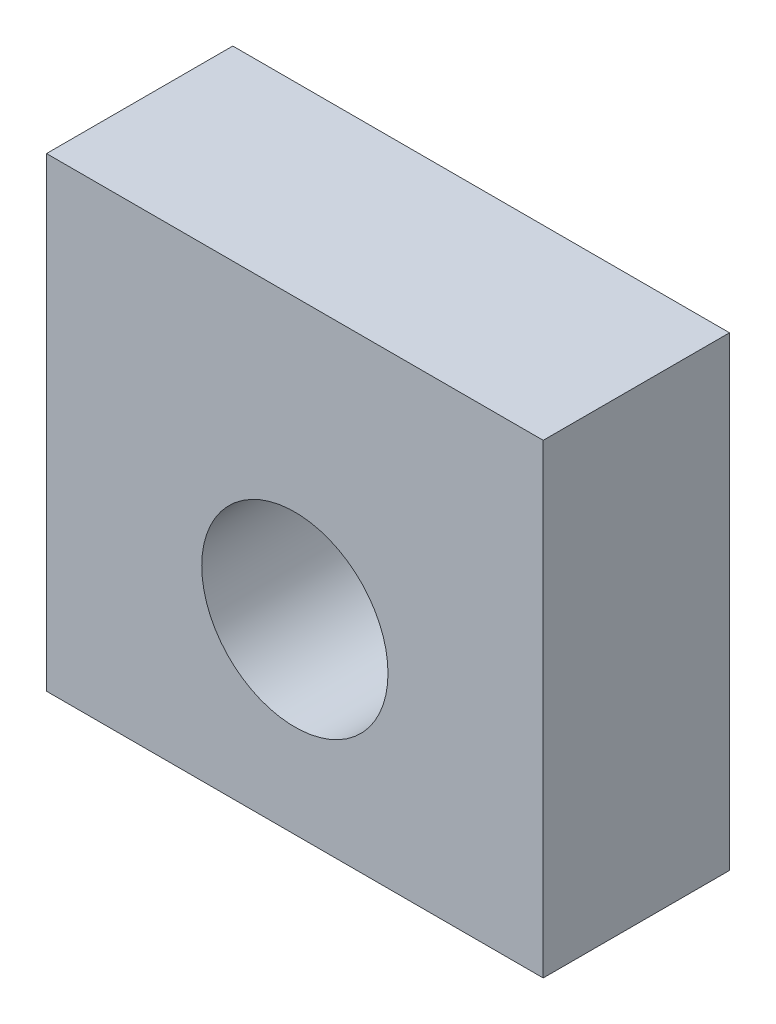
ISO-10303-21;
HEADER;
FILE_DESCRIPTION(('STEP AP214'),'2;1');
FILE_NAME('part.step','',(''),(''),'','','');
FILE_SCHEMA(('AUTOMOTIVE_DESIGN { 1 0 10303 214 1 1 1 1 }'));
ENDSEC;
DATA;
#1=APPLICATION_CONTEXT('core data for automotive mechanical design processes');
#2=APPLICATION_PROTOCOL_DEFINITION('international standard','automotive_design',2000,#1);
#3=PRODUCT_CONTEXT('',#1,'mechanical');
#4=PRODUCT('Part','Part','',(#3));
#5=PRODUCT_RELATED_PRODUCT_CATEGORY('part','',(#4));
#6=PRODUCT_DEFINITION_FORMATION('','',#4);
#7=PRODUCT_DEFINITION_CONTEXT('part definition',#1,'design');
#8=PRODUCT_DEFINITION('design','',#6,#7);
#9=PRODUCT_DEFINITION_SHAPE('','',#8);
#10=(LENGTH_UNIT() NAMED_UNIT(*) SI_UNIT(.MILLI.,.METRE.));
#11=(NAMED_UNIT(*) PLANE_ANGLE_UNIT() SI_UNIT($,.RADIAN.));
#12=(NAMED_UNIT(*) SI_UNIT($,.STERADIAN.) SOLID_ANGLE_UNIT());
#13=UNCERTAINTY_MEASURE_WITH_UNIT(LENGTH_MEASURE(1.E-05),#10,'distance_accuracy_value','');
#14=(GEOMETRIC_REPRESENTATION_CONTEXT(3) GLOBAL_UNCERTAINTY_ASSIGNED_CONTEXT((#13)) GLOBAL_UNIT_ASSIGNED_CONTEXT((#10,
#11,#12)) REPRESENTATION_CONTEXT('',''));
#15=CARTESIAN_POINT('',(0.,0.,0.));
#16=DIRECTION('',(0.,0.,1.));
#17=DIRECTION('',(1.,0.,0.));
#18=AXIS2_PLACEMENT_3D('',#15,#16,#17);
#19=CARTESIAN_POINT('',(0.,0.,3.));
#20=DIRECTION('',(0.,0.,1.));
#21=DIRECTION('',(1.,0.,0.));
#22=AXIS2_PLACEMENT_3D('',#19,#20,#21);
#23=PLANE('',#22);
#24=DIRECTION('',(0.,-1.,0.));
#25=VECTOR('',#24,1.);
#26=CARTESIAN_POINT('',(-4.,-3.75,3.));
#27=LINE('',#26,#25);
#28=CARTESIAN_POINT('',(-4.,3.75,3.));
#29=VERTEX_POINT('',#28);
#30=CARTESIAN_POINT('',(-4.,-3.75,3.));
#31=VERTEX_POINT('',#30);
#32=EDGE_CURVE('E98',#29,#31,#27,.T.);
#33=ORIENTED_EDGE('',*,*,#32,.T.);
#34=DIRECTION('',(1.,0.,0.));
#35=VECTOR('',#34,1.);
#36=CARTESIAN_POINT('',(4.,-3.75,3.));
#37=LINE('',#36,#35);
#38=CARTESIAN_POINT('',(4.,-3.75,3.));
#39=VERTEX_POINT('',#38);
#40=EDGE_CURVE('E93',#31,#39,#37,.T.);
#41=ORIENTED_EDGE('',*,*,#40,.T.);
#42=DIRECTION('',(0.,1.,0.));
#43=VECTOR('',#42,1.);
#44=CARTESIAN_POINT('',(4.,-3.75,3.));
#45=LINE('',#44,#43);
#46=CARTESIAN_POINT('',(4.,3.75,3.));
#47=VERTEX_POINT('',#46);
#48=EDGE_CURVE('E96',#39,#47,#45,.T.);
#49=ORIENTED_EDGE('',*,*,#48,.T.);
#50=DIRECTION('',(-1.,0.,0.));
#51=VECTOR('',#50,1.);
#52=CARTESIAN_POINT('',(4.,3.75,3.));
#53=LINE('',#52,#51);
#54=EDGE_CURVE('E63',#47,#29,#53,.T.);
#55=ORIENTED_EDGE('',*,*,#54,.T.);
#56=EDGE_LOOP('',(#33,#41,#49,#55));
#57=FACE_BOUND('',#56,.T.);
#58=CARTESIAN_POINT('',(0.,-0.75,3.));
#59=DIRECTION('',(0.,0.,1.));
#60=DIRECTION('',(1.,0.,0.));
#61=AXIS2_PLACEMENT_3D('',#58,#59,#60);
#62=CIRCLE('',#61,1.5);
#63=CARTESIAN_POINT('',(1.5,-0.75,3.));
#64=VERTEX_POINT('',#63);
#65=EDGE_CURVE('E118',#64,#64,#62,.T.);
#66=ORIENTED_EDGE('',*,*,#65,.F.);
#67=EDGE_LOOP('',(#66));
#68=FACE_BOUND('',#67,.T.);
#69=ADVANCED_FACE('F45',(#57,#68),#23,.T.);
#70=CARTESIAN_POINT('',(0.,0.,0.));
#71=DIRECTION('',(0.,0.,1.));
#72=DIRECTION('',(1.,0.,0.));
#73=AXIS2_PLACEMENT_3D('',#70,#71,#72);
#74=PLANE('',#73);
#75=DIRECTION('',(0.,-1.,0.));
#76=VECTOR('',#75,1.);
#77=CARTESIAN_POINT('',(-4.,-3.75,0.));
#78=LINE('',#77,#76);
#79=CARTESIAN_POINT('',(-4.,3.75,0.));
#80=VERTEX_POINT('',#79);
#81=CARTESIAN_POINT('',(-4.,-3.75,0.));
#82=VERTEX_POINT('',#81);
#83=EDGE_CURVE('E114',#80,#82,#78,.T.);
#84=ORIENTED_EDGE('',*,*,#83,.F.);
#85=DIRECTION('',(-1.,0.,0.));
#86=VECTOR('',#85,1.);
#87=CARTESIAN_POINT('',(4.,3.75,0.));
#88=LINE('',#87,#86);
#89=CARTESIAN_POINT('',(4.,3.75,0.));
#90=VERTEX_POINT('',#89);
#91=EDGE_CURVE('E86',#90,#80,#88,.T.);
#92=ORIENTED_EDGE('',*,*,#91,.F.);
#93=DIRECTION('',(0.,1.,0.));
#94=VECTOR('',#93,1.);
#95=CARTESIAN_POINT('',(4.,-3.75,0.));
#96=LINE('',#95,#94);
#97=CARTESIAN_POINT('',(4.,-3.75,0.));
#98=VERTEX_POINT('',#97);
#99=EDGE_CURVE('E80',#98,#90,#96,.T.);
#100=ORIENTED_EDGE('',*,*,#99,.F.);
#101=DIRECTION('',(1.,0.,0.));
#102=VECTOR('',#101,1.);
#103=CARTESIAN_POINT('',(4.,-3.75,0.));
#104=LINE('',#103,#102);
#105=EDGE_CURVE('E103',#82,#98,#104,.T.);
#106=ORIENTED_EDGE('',*,*,#105,.F.);
#107=EDGE_LOOP('',(#84,#92,#100,#106));
#108=FACE_BOUND('',#107,.T.);
#109=CARTESIAN_POINT('',(0.,-0.75,0.));
#110=DIRECTION('',(0.,0.,1.));
#111=DIRECTION('',(1.,0.,0.));
#112=AXIS2_PLACEMENT_3D('',#109,#110,#111);
#113=CIRCLE('',#112,1.5);
#114=CARTESIAN_POINT('',(1.5,-0.75,0.));
#115=VERTEX_POINT('',#114);
#116=EDGE_CURVE('E136',#115,#115,#113,.T.);
#117=ORIENTED_EDGE('',*,*,#116,.T.);
#118=EDGE_LOOP('',(#117));
#119=FACE_BOUND('',#118,.T.);
#120=ADVANCED_FACE('F131',(#108,#119),#74,.F.);
#121=CARTESIAN_POINT('',(-4.,-3.75,3.));
#122=DIRECTION('',(1.,0.,0.));
#123=DIRECTION('',(0.,0.,-1.));
#124=AXIS2_PLACEMENT_3D('',#121,#122,#123);
#125=PLANE('',#124);
#126=ORIENTED_EDGE('',*,*,#83,.T.);
#127=DIRECTION('',(0.,0.,-1.));
#128=VECTOR('',#127,1.);
#129=CARTESIAN_POINT('',(-4.,-3.75,3.));
#130=LINE('',#129,#128);
#131=EDGE_CURVE('E11',#31,#82,#130,.T.);
#132=ORIENTED_EDGE('',*,*,#131,.F.);
#133=ORIENTED_EDGE('',*,*,#32,.F.);
#134=DIRECTION('',(0.,0.,-1.));
#135=VECTOR('',#134,1.);
#136=CARTESIAN_POINT('',(-4.,3.75,3.));
#137=LINE('',#136,#135);
#138=EDGE_CURVE('E110',#29,#80,#137,.T.);
#139=ORIENTED_EDGE('',*,*,#138,.T.);
#140=EDGE_LOOP('',(#126,#132,#133,#139));
#141=FACE_BOUND('',#140,.T.);
#142=ADVANCED_FACE('F47',(#141),#125,.F.);
#143=CARTESIAN_POINT('',(4.,-3.75,3.));
#144=DIRECTION('',(0.,1.,0.));
#145=DIRECTION('',(-1.,0.,0.));
#146=AXIS2_PLACEMENT_3D('',#143,#144,#145);
#147=PLANE('',#146);
#148=ORIENTED_EDGE('',*,*,#105,.T.);
#149=DIRECTION('',(0.,0.,-1.));
#150=VECTOR('',#149,1.);
#151=CARTESIAN_POINT('',(4.,-3.75,3.));
#152=LINE('',#151,#150);
#153=EDGE_CURVE('E55',#39,#98,#152,.T.);
#154=ORIENTED_EDGE('',*,*,#153,.F.);
#155=ORIENTED_EDGE('',*,*,#40,.F.);
#156=ORIENTED_EDGE('',*,*,#131,.T.);
#157=EDGE_LOOP('',(#148,#154,#155,#156));
#158=FACE_BOUND('',#157,.T.);
#159=ADVANCED_FACE('F102',(#158),#147,.F.);
#160=CARTESIAN_POINT('',(4.,-3.75,3.));
#161=DIRECTION('',(-1.,0.,0.));
#162=DIRECTION('',(0.,-1.,0.));
#163=AXIS2_PLACEMENT_3D('',#160,#161,#162);
#164=PLANE('',#163);
#165=ORIENTED_EDGE('',*,*,#99,.T.);
#166=DIRECTION('',(0.,0.,-1.));
#167=VECTOR('',#166,1.);
#168=CARTESIAN_POINT('',(4.,3.75,3.));
#169=LINE('',#168,#167);
#170=EDGE_CURVE('E105',#47,#90,#169,.T.);
#171=ORIENTED_EDGE('',*,*,#170,.F.);
#172=ORIENTED_EDGE('',*,*,#48,.F.);
#173=ORIENTED_EDGE('',*,*,#153,.T.);
#174=EDGE_LOOP('',(#165,#171,#172,#173));
#175=FACE_BOUND('',#174,.T.);
#176=ADVANCED_FACE('F106',(#175),#164,.F.);
#177=CARTESIAN_POINT('',(4.,3.75,3.));
#178=DIRECTION('',(0.,-1.,0.));
#179=DIRECTION('',(1.,0.,0.));
#180=AXIS2_PLACEMENT_3D('',#177,#178,#179);
#181=PLANE('',#180);
#182=ORIENTED_EDGE('',*,*,#91,.T.);
#183=ORIENTED_EDGE('',*,*,#138,.F.);
#184=ORIENTED_EDGE('',*,*,#54,.F.);
#185=ORIENTED_EDGE('',*,*,#170,.T.);
#186=EDGE_LOOP('',(#182,#183,#184,#185));
#187=FACE_BOUND('',#186,.T.);
#188=ADVANCED_FACE('F128',(#187),#181,.F.);
#189=CARTESIAN_POINT('',(0.,-0.75,3.));
#190=DIRECTION('',(0.,0.,-1.));
#191=DIRECTION('',(-1.,0.,0.));
#192=AXIS2_PLACEMENT_3D('',#189,#190,#191);
#193=CYLINDRICAL_SURFACE('',#192,1.5);
#194=ORIENTED_EDGE('',*,*,#65,.T.);
#195=EDGE_LOOP('',(#194));
#196=FACE_BOUND('',#195,.T.);
#197=ORIENTED_EDGE('',*,*,#116,.F.);
#198=EDGE_LOOP('',(#197));
#199=FACE_BOUND('',#198,.T.);
#200=ADVANCED_FACE('F144',(#196,#199),#193,.F.);
#201=CLOSED_SHELL('',(#69,#120,#142,#159,#176,#188,#200));
#202=MANIFOLD_SOLID_BREP('B2',#201);
#203=ADVANCED_BREP_SHAPE_REPRESENTATION('',(#18,#202),#14);
#204=SHAPE_DEFINITION_REPRESENTATION(#9,#203);
ENDSEC;
END-ISO-10303-21;
